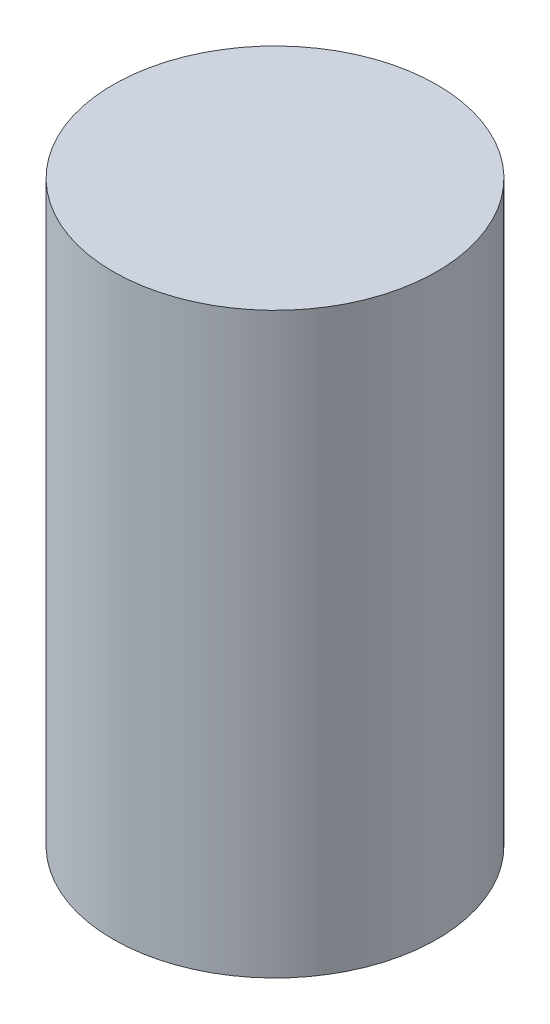
ISO-10303-21;
HEADER;
FILE_DESCRIPTION(('STEP AP214'),'2;1');
FILE_NAME('part.step','',(''),(''),'','','');
FILE_SCHEMA(('AUTOMOTIVE_DESIGN { 1 0 10303 214 1 1 1 1 }'));
ENDSEC;
DATA;
#1=APPLICATION_CONTEXT('core data for automotive mechanical design processes');
#2=APPLICATION_PROTOCOL_DEFINITION('international standard','automotive_design',2000,#1);
#3=PRODUCT_CONTEXT('',#1,'mechanical');
#4=PRODUCT('Part','Part','',(#3));
#5=PRODUCT_RELATED_PRODUCT_CATEGORY('part','',(#4));
#6=PRODUCT_DEFINITION_FORMATION('','',#4);
#7=PRODUCT_DEFINITION_CONTEXT('part definition',#1,'design');
#8=PRODUCT_DEFINITION('design','',#6,#7);
#9=PRODUCT_DEFINITION_SHAPE('','',#8);
#10=(LENGTH_UNIT() NAMED_UNIT(*) SI_UNIT(.MILLI.,.METRE.));
#11=(NAMED_UNIT(*) PLANE_ANGLE_UNIT() SI_UNIT($,.RADIAN.));
#12=(NAMED_UNIT(*) SI_UNIT($,.STERADIAN.) SOLID_ANGLE_UNIT());
#13=UNCERTAINTY_MEASURE_WITH_UNIT(LENGTH_MEASURE(1.E-05),#10,'distance_accuracy_value','');
#14=(GEOMETRIC_REPRESENTATION_CONTEXT(3) GLOBAL_UNCERTAINTY_ASSIGNED_CONTEXT((#13)) GLOBAL_UNIT_ASSIGNED_CONTEXT((#10,
#11,#12)) REPRESENTATION_CONTEXT('',''));
#15=CARTESIAN_POINT('',(0.,0.,0.));
#16=DIRECTION('',(0.,0.,1.));
#17=DIRECTION('',(1.,0.,0.));
#18=AXIS2_PLACEMENT_3D('',#15,#16,#17);
#19=CARTESIAN_POINT('',(0.,20.,0.));
#20=DIRECTION('',(0.,-1.,0.));
#21=DIRECTION('',(0.,0.,-1.));
#22=AXIS2_PLACEMENT_3D('',#19,#20,#21);
#23=CYLINDRICAL_SURFACE('',#22,7.);
#24=CARTESIAN_POINT('',(0.,0.,0.));
#25=DIRECTION('',(0.,1.,0.));
#26=DIRECTION('',(0.,0.,1.));
#27=AXIS2_PLACEMENT_3D('',#24,#25,#26);
#28=CIRCLE('',#27,7.);
#29=CARTESIAN_POINT('',(0.,0.,7.));
#30=VERTEX_POINT('',#29);
#31=EDGE_CURVE('E10',#30,#30,#28,.T.);
#32=ORIENTED_EDGE('',*,*,#31,.T.);
#33=EDGE_LOOP('',(#32));
#34=FACE_BOUND('',#33,.T.);
#35=CARTESIAN_POINT('',(0.,25.,0.));
#36=DIRECTION('',(0.,1.,0.));
#37=DIRECTION('',(0.,0.,1.));
#38=AXIS2_PLACEMENT_3D('',#35,#36,#37);
#39=CIRCLE('',#38,7.);
#40=CARTESIAN_POINT('',(0.,25.,7.));
#41=VERTEX_POINT('',#40);
#42=EDGE_CURVE('E48',#41,#41,#39,.T.);
#43=ORIENTED_EDGE('',*,*,#42,.F.);
#44=EDGE_LOOP('',(#43));
#45=FACE_BOUND('',#44,.T.);
#46=ADVANCED_FACE('F41',(#34,#45),#23,.T.);
#47=CARTESIAN_POINT('',(0.,0.,0.));
#48=DIRECTION('',(0.,1.,0.));
#49=DIRECTION('',(0.,0.,1.));
#50=AXIS2_PLACEMENT_3D('',#47,#48,#49);
#51=PLANE('',#50);
#52=ORIENTED_EDGE('',*,*,#31,.F.);
#53=EDGE_LOOP('',(#52));
#54=FACE_BOUND('',#53,.T.);
#55=ADVANCED_FACE('F58',(#54),#51,.F.);
#56=CARTESIAN_POINT('',(0.,25.,0.));
#57=DIRECTION('',(0.,1.,0.));
#58=DIRECTION('',(0.,0.,1.));
#59=AXIS2_PLACEMENT_3D('',#56,#57,#58);
#60=PLANE('',#59);
#61=ORIENTED_EDGE('',*,*,#42,.T.);
#62=EDGE_LOOP('',(#61));
#63=FACE_BOUND('',#62,.T.);
#64=ADVANCED_FACE('F55',(#63),#60,.T.);
#65=CLOSED_SHELL('',(#46,#55,#64));
#66=MANIFOLD_SOLID_BREP('B2',#65);
#67=ADVANCED_BREP_SHAPE_REPRESENTATION('',(#18,#66),#14);
#68=SHAPE_DEFINITION_REPRESENTATION(#9,#67);
ENDSEC;
END-ISO-10303-21;
